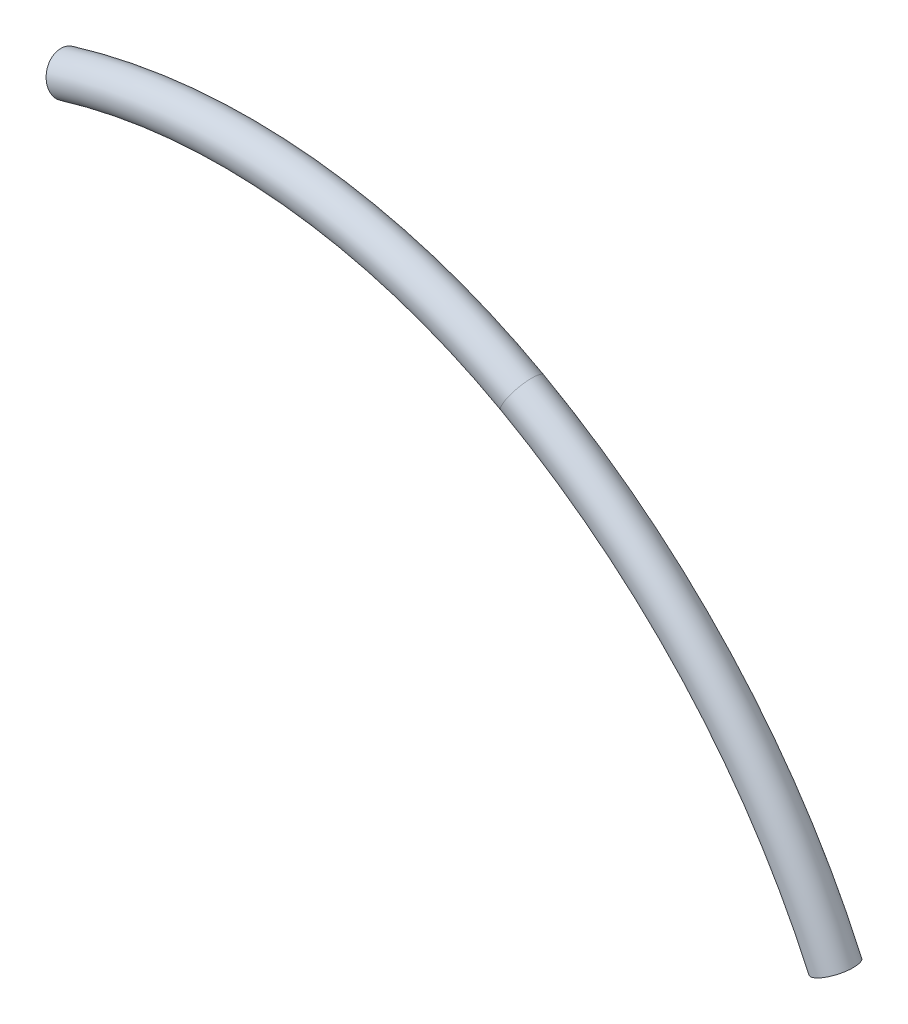
ISO-10303-21;
HEADER;
FILE_DESCRIPTION(('STEP AP214'),'2;1');
FILE_NAME('part.step','',(''),(''),'','','');
FILE_SCHEMA(('AUTOMOTIVE_DESIGN { 1 0 10303 214 1 1 1 1 }'));
ENDSEC;
DATA;
#1=APPLICATION_CONTEXT('core data for automotive mechanical design processes');
#2=APPLICATION_PROTOCOL_DEFINITION('international standard','automotive_design',2000,#1);
#3=PRODUCT_CONTEXT('',#1,'mechanical');
#4=PRODUCT('Part','Part','',(#3));
#5=PRODUCT_RELATED_PRODUCT_CATEGORY('part','',(#4));
#6=PRODUCT_DEFINITION_FORMATION('','',#4);
#7=PRODUCT_DEFINITION_CONTEXT('part definition',#1,'design');
#8=PRODUCT_DEFINITION('design','',#6,#7);
#9=PRODUCT_DEFINITION_SHAPE('','',#8);
#10=(LENGTH_UNIT() NAMED_UNIT(*) SI_UNIT(.MILLI.,.METRE.));
#11=(NAMED_UNIT(*) PLANE_ANGLE_UNIT() SI_UNIT($,.RADIAN.));
#12=(NAMED_UNIT(*) SI_UNIT($,.STERADIAN.) SOLID_ANGLE_UNIT());
#13=UNCERTAINTY_MEASURE_WITH_UNIT(LENGTH_MEASURE(1.E-05),#10,'distance_accuracy_value','');
#14=(GEOMETRIC_REPRESENTATION_CONTEXT(3) GLOBAL_UNCERTAINTY_ASSIGNED_CONTEXT((#13)) GLOBAL_UNIT_ASSIGNED_CONTEXT((#10,
#11,#12)) REPRESENTATION_CONTEXT('',''));
#15=CARTESIAN_POINT('',(0.,0.,0.));
#16=DIRECTION('',(0.,0.,1.));
#17=DIRECTION('',(1.,0.,0.));
#18=AXIS2_PLACEMENT_3D('',#15,#16,#17);
#19=CARTESIAN_POINT('',(2562.97505625033,-1524.72267709629,0.));
#20=DIRECTION('',(0.,0.,1.));
#21=DIRECTION('',(1.,0.,0.));
#22=AXIS2_PLACEMENT_3D('',#19,#20,#21);
#23=TOROIDAL_SURFACE('',#22,1520.31985117615,50.8000000000007);
#24=CARTESIAN_POINT('',(3300.92113820662,-195.509364642024,0.));
#25=DIRECTION('',(-0.874298465172285,0.485388703821368,0.));
#26=DIRECTION('',(-0.485388703821368,-0.874298465172285,0.));
#27=AXIS2_PLACEMENT_3D('',#24,#25,#26);
#28=CIRCLE('',#27,50.8000000000007);
#29=CARTESIAN_POINT('',(3325.57888436074,-151.095002611272,0.));
#30=VERTEX_POINT('',#29);
#31=EDGE_CURVE('E41',#30,#30,#28,.T.);
#32=CARTESIAN_POINT('',(2120.77012035913,-70.1343351404851,0.));
#33=DIRECTION('',(-0.956764683977851,-0.290863094071356,0.));
#34=DIRECTION('',(0.290863094071356,-0.956764683977851,0.));
#35=AXIS2_PLACEMENT_3D('',#32,#33,#34);
#36=CIRCLE('',#35,50.8000000000007);
#37=CARTESIAN_POINT('',(2105.9942751803,-21.5306891944098,0.));
#38=VERTEX_POINT('',#37);
#39=EDGE_CURVE('E10',#38,#38,#36,.T.);
#40=CARTESIAN_POINT('',(2562.97505625033,-1524.72267709629,0.));
#41=DIRECTION('',(0.,0.,1.));
#42=DIRECTION('',(1.,0.,0.));
#43=AXIS2_PLACEMENT_3D('',#40,#41,#42);
#44=CIRCLE('',#43,1571.11985117615);
#45=EDGE_CURVE('',#30,#38,#44,.T.);
#46=ORIENTED_EDGE('',*,*,#31,.T.);
#47=ORIENTED_EDGE('',*,*,#39,.F.);
#48=ORIENTED_EDGE('',*,*,#45,.T.);
#49=ORIENTED_EDGE('',*,*,#45,.F.);
#50=EDGE_LOOP('',(#46,#48,#47,#49));
#51=FACE_BOUND('',#50,.T.);
#52=ADVANCED_FACE('F35',(#51),#23,.T.);
#53=CARTESIAN_POINT('',(2378.72783107636,-1856.59497843673,0.));
#54=DIRECTION('',(0.,0.,-1.));
#55=DIRECTION('',(-1.,0.,0.));
#56=AXIS2_PLACEMENT_3D('',#53,#54,#55);
#57=TOROIDAL_SURFACE('',#56,1899.90681668117,50.8000000000007);
#58=CARTESIAN_POINT('',(4111.7463897158,-1077.9470557638,0.));
#59=DIRECTION('',(-0.409834796020734,0.912159766691473,0.));
#60=DIRECTION('',(-0.912159766691473,-0.409834796020734,0.));
#61=AXIS2_PLACEMENT_3D('',#58,#59,#60);
#62=CIRCLE('',#61,50.8000000000007);
#63=CARTESIAN_POINT('',(4158.08410586373,-1057.12744812595,0.));
#64=VERTEX_POINT('',#63);
#65=EDGE_CURVE('E45',#64,#64,#62,.T.);
#66=CARTESIAN_POINT('',(2378.72783107636,-1856.59497843673,0.));
#67=DIRECTION('',(0.,0.,-1.));
#68=DIRECTION('',(-1.,0.,0.));
#69=AXIS2_PLACEMENT_3D('',#66,#67,#68);
#70=CIRCLE('',#69,1950.70681668117);
#71=EDGE_CURVE('',#30,#64,#70,.T.);
#72=ORIENTED_EDGE('',*,*,#31,.F.);
#73=ORIENTED_EDGE('',*,*,#65,.T.);
#74=ORIENTED_EDGE('',*,*,#71,.T.);
#75=ORIENTED_EDGE('',*,*,#71,.F.);
#76=EDGE_LOOP('',(#72,#74,#73,#75));
#77=FACE_BOUND('',#76,.T.);
#78=ADVANCED_FACE('F52',(#77),#57,.T.);
#79=CARTESIAN_POINT('',(2120.77012035913,-70.1343351404851,0.));
#80=DIRECTION('',(-0.956764683977851,-0.290863094071356,0.));
#81=DIRECTION('',(0.290863094071356,-0.956764683977851,0.));
#82=AXIS2_PLACEMENT_3D('',#79,#80,#81);
#83=PLANE('',#82);
#84=ORIENTED_EDGE('',*,*,#39,.T.);
#85=EDGE_LOOP('',(#84));
#86=FACE_BOUND('',#85,.T.);
#87=ADVANCED_FACE('F56',(#86),#83,.T.);
#88=CARTESIAN_POINT('',(4111.7463897158,-1077.9470557638,0.));
#89=DIRECTION('',(-0.409834796020734,0.912159766691473,0.));
#90=DIRECTION('',(-0.912159766691473,-0.409834796020734,0.));
#91=AXIS2_PLACEMENT_3D('',#88,#89,#90);
#92=PLANE('',#91);
#93=ORIENTED_EDGE('',*,*,#65,.F.);
#94=EDGE_LOOP('',(#93));
#95=FACE_BOUND('',#94,.T.);
#96=ADVANCED_FACE('F54',(#95),#92,.F.);
#97=CLOSED_SHELL('',(#52,#78,#87,#96));
#98=MANIFOLD_SOLID_BREP('B2',#97);
#99=ADVANCED_BREP_SHAPE_REPRESENTATION('',(#18,#98),#14);
#100=SHAPE_DEFINITION_REPRESENTATION(#9,#99);
ENDSEC;
END-ISO-10303-21;
